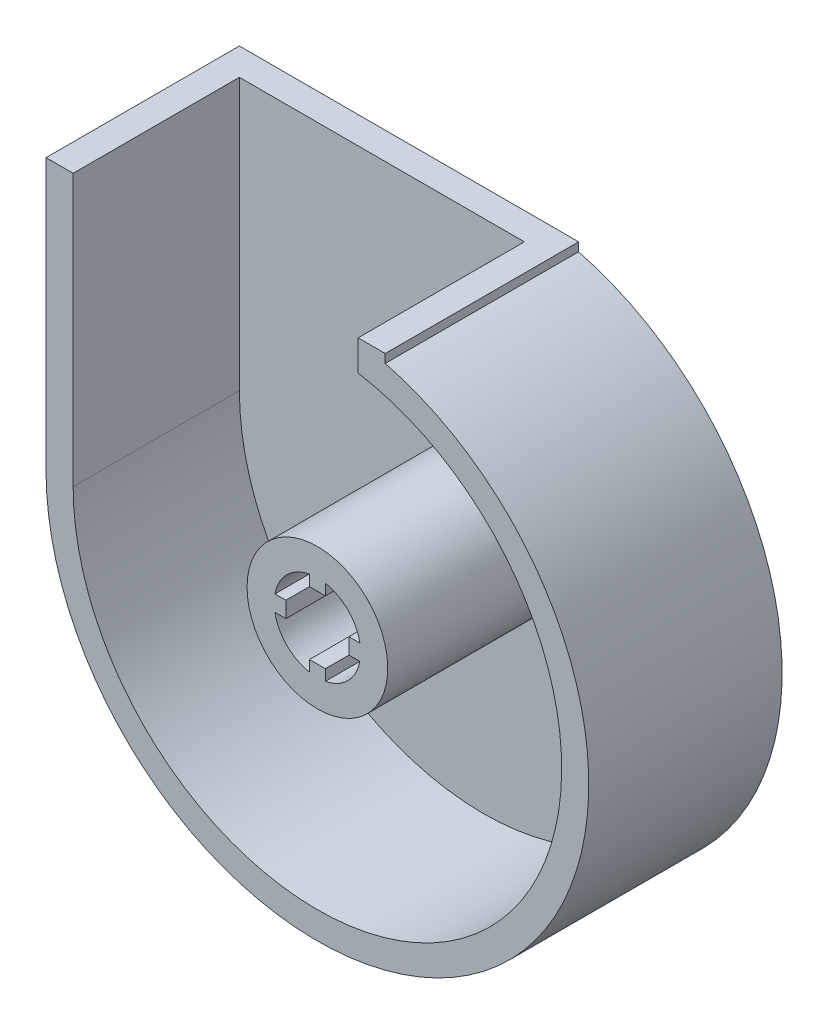
ISO-10303-21;
HEADER;
FILE_DESCRIPTION(('STEP AP214'),'2;1');
FILE_NAME('part.step','',(''),(''),'','','');
FILE_SCHEMA(('AUTOMOTIVE_DESIGN { 1 0 10303 214 1 1 1 1 }'));
ENDSEC;
DATA;
#1=APPLICATION_CONTEXT('core data for automotive mechanical design processes');
#2=APPLICATION_PROTOCOL_DEFINITION('international standard','automotive_design',2000,#1);
#3=PRODUCT_CONTEXT('',#1,'mechanical');
#4=PRODUCT('Part','Part','',(#3));
#5=PRODUCT_RELATED_PRODUCT_CATEGORY('part','',(#4));
#6=PRODUCT_DEFINITION_FORMATION('','',#4);
#7=PRODUCT_DEFINITION_CONTEXT('part definition',#1,'design');
#8=PRODUCT_DEFINITION('design','',#6,#7);
#9=PRODUCT_DEFINITION_SHAPE('','',#8);
#10=(LENGTH_UNIT() NAMED_UNIT(*) SI_UNIT(.MILLI.,.METRE.));
#11=(NAMED_UNIT(*) PLANE_ANGLE_UNIT() SI_UNIT($,.RADIAN.));
#12=(NAMED_UNIT(*) SI_UNIT($,.STERADIAN.) SOLID_ANGLE_UNIT());
#13=UNCERTAINTY_MEASURE_WITH_UNIT(LENGTH_MEASURE(1.E-05),#10,'distance_accuracy_value','');
#14=(GEOMETRIC_REPRESENTATION_CONTEXT(3) GLOBAL_UNCERTAINTY_ASSIGNED_CONTEXT((#13)) GLOBAL_UNIT_ASSIGNED_CONTEXT((#10,
#11,#12)) REPRESENTATION_CONTEXT('',''));
#15=CARTESIAN_POINT('',(0.,0.,0.));
#16=DIRECTION('',(0.,0.,1.));
#17=DIRECTION('',(1.,0.,0.));
#18=AXIS2_PLACEMENT_3D('',#15,#16,#17);
#19=CARTESIAN_POINT('',(0.,0.,0.));
#20=DIRECTION('',(0.,0.,-1.));
#21=DIRECTION('',(-1.,0.,0.));
#22=AXIS2_PLACEMENT_3D('',#19,#20,#21);
#23=PLANE('',#22);
#24=CARTESIAN_POINT('',(0.,0.,0.));
#25=DIRECTION('',(0.,0.,-1.));
#26=DIRECTION('',(-1.,0.,0.));
#27=AXIS2_PLACEMENT_3D('',#24,#25,#26);
#28=CIRCLE('',#27,72.01);
#29=CARTESIAN_POINT('',(12.01,71.0014084367346,0.));
#30=VERTEX_POINT('',#29);
#31=CARTESIAN_POINT('',(-72.01,0.,0.));
#32=VERTEX_POINT('',#31);
#33=EDGE_CURVE('E284',#30,#32,#28,.T.);
#34=ORIENTED_EDGE('',*,*,#33,.T.);
#35=DIRECTION('',(0.,-1.,0.));
#36=VECTOR('',#35,1.);
#37=CARTESIAN_POINT('',(-72.01,0.,0.));
#38=LINE('',#37,#36);
#39=CARTESIAN_POINT('',(-72.01,80.,0.));
#40=VERTEX_POINT('',#39);
#41=EDGE_CURVE('E280',#40,#32,#38,.T.);
#42=ORIENTED_EDGE('',*,*,#41,.F.);
#43=DIRECTION('',(-1.,0.,0.));
#44=VECTOR('',#43,1.);
#45=CARTESIAN_POINT('',(0.,80.,0.));
#46=LINE('',#45,#44);
#47=CARTESIAN_POINT('',(-80.,80.,0.));
#48=VERTEX_POINT('',#47);
#49=EDGE_CURVE('E282',#40,#48,#46,.T.);
#50=ORIENTED_EDGE('',*,*,#49,.T.);
#51=DIRECTION('',(0.,-1.,0.));
#52=VECTOR('',#51,1.);
#53=CARTESIAN_POINT('',(-80.,0.,0.));
#54=LINE('',#53,#52);
#55=CARTESIAN_POINT('',(-80.,0.,0.));
#56=VERTEX_POINT('',#55);
#57=EDGE_CURVE('E11',#48,#56,#54,.T.);
#58=ORIENTED_EDGE('',*,*,#57,.T.);
#59=CARTESIAN_POINT('',(0.,0.,0.));
#60=DIRECTION('',(0.,0.,-1.));
#61=DIRECTION('',(-1.,0.,0.));
#62=AXIS2_PLACEMENT_3D('',#59,#60,#61);
#63=CIRCLE('',#62,80.);
#64=CARTESIAN_POINT('',(20.,77.4596669241483,0.));
#65=VERTEX_POINT('',#64);
#66=EDGE_CURVE('E277',#65,#56,#63,.T.);
#67=ORIENTED_EDGE('',*,*,#66,.F.);
#68=DIRECTION('',(0.,-1.,0.));
#69=VECTOR('',#68,1.);
#70=CARTESIAN_POINT('',(20.,0.,0.));
#71=LINE('',#70,#69);
#72=CARTESIAN_POINT('',(20.,80.,0.));
#73=VERTEX_POINT('',#72);
#74=EDGE_CURVE('E279',#73,#65,#71,.T.);
#75=ORIENTED_EDGE('',*,*,#74,.F.);
#76=CARTESIAN_POINT('',(12.01,80.,0.));
#77=VERTEX_POINT('',#76);
#78=EDGE_CURVE('E285',#73,#77,#46,.T.);
#79=ORIENTED_EDGE('',*,*,#78,.T.);
#80=DIRECTION('',(0.,-1.,0.));
#81=VECTOR('',#80,1.);
#82=CARTESIAN_POINT('',(12.01,0.,0.));
#83=LINE('',#82,#81);
#84=EDGE_CURVE('E65',#77,#30,#83,.T.);
#85=ORIENTED_EDGE('',*,*,#84,.T.);
#86=EDGE_LOOP('',(#34,#42,#50,#58,#67,#75,#79,#85));
#87=FACE_BOUND('',#86,.T.);
#88=ADVANCED_FACE('F43',(#87),#23,.F.);
#89=CARTESIAN_POINT('',(0.,0.,0.));
#90=DIRECTION('',(0.,0.,-1.));
#91=DIRECTION('',(-1.,0.,0.));
#92=AXIS2_PLACEMENT_3D('',#89,#90,#91);
#93=CIRCLE('',#92,20.74);
#94=CARTESIAN_POINT('',(-20.74,0.,0.));
#95=VERTEX_POINT('',#94);
#96=EDGE_CURVE('E47',#95,#95,#93,.F.);
#97=ORIENTED_EDGE('',*,*,#96,.T.);
#98=EDGE_LOOP('',(#97));
#99=FACE_BOUND('',#98,.T.);
#100=CARTESIAN_POINT('',(0.,0.,0.));
#101=DIRECTION('',(0.,0.,-1.));
#102=DIRECTION('',(-1.,0.,0.));
#103=AXIS2_PLACEMENT_3D('',#100,#101,#102);
#104=CIRCLE('',#103,12.75);
#105=CARTESIAN_POINT('',(12.5315601582564,2.35,0.));
#106=VERTEX_POINT('',#105);
#107=CARTESIAN_POINT('',(2.35,12.5315601582564,0.));
#108=VERTEX_POINT('',#107);
#109=EDGE_CURVE('E272',#106,#108,#104,.F.);
#110=ORIENTED_EDGE('',*,*,#109,.F.);
#111=DIRECTION('',(1.,0.,0.));
#112=VECTOR('',#111,1.);
#113=CARTESIAN_POINT('',(12.5315601582564,2.35,0.));
#114=LINE('',#113,#112);
#115=CARTESIAN_POINT('',(9.3,2.35,0.));
#116=VERTEX_POINT('',#115);
#117=EDGE_CURVE('E270',#116,#106,#114,.T.);
#118=ORIENTED_EDGE('',*,*,#117,.F.);
#119=DIRECTION('',(0.,1.,0.));
#120=VECTOR('',#119,1.);
#121=CARTESIAN_POINT('',(9.3,2.35,0.));
#122=LINE('',#121,#120);
#123=CARTESIAN_POINT('',(9.3,-2.35,0.));
#124=VERTEX_POINT('',#123);
#125=EDGE_CURVE('E268',#124,#116,#122,.T.);
#126=ORIENTED_EDGE('',*,*,#125,.F.);
#127=DIRECTION('',(-1.,0.,0.));
#128=VECTOR('',#127,1.);
#129=CARTESIAN_POINT('',(9.3,-2.35,0.));
#130=LINE('',#129,#128);
#131=CARTESIAN_POINT('',(12.5315601582564,-2.35,0.));
#132=VERTEX_POINT('',#131);
#133=EDGE_CURVE('E266',#132,#124,#130,.T.);
#134=ORIENTED_EDGE('',*,*,#133,.F.);
#135=CARTESIAN_POINT('',(0.,0.,0.));
#136=DIRECTION('',(0.,0.,-1.));
#137=DIRECTION('',(-1.,0.,0.));
#138=AXIS2_PLACEMENT_3D('',#135,#136,#137);
#139=CIRCLE('',#138,12.75);
#140=CARTESIAN_POINT('',(2.35,-12.5315601582564,0.));
#141=VERTEX_POINT('',#140);
#142=EDGE_CURVE('E264',#141,#132,#139,.F.);
#143=ORIENTED_EDGE('',*,*,#142,.F.);
#144=DIRECTION('',(0.,-1.,0.));
#145=VECTOR('',#144,1.);
#146=CARTESIAN_POINT('',(2.35,-12.5315601582564,0.));
#147=LINE('',#146,#145);
#148=CARTESIAN_POINT('',(2.35,-9.3,0.));
#149=VERTEX_POINT('',#148);
#150=EDGE_CURVE('E262',#149,#141,#147,.T.);
#151=ORIENTED_EDGE('',*,*,#150,.F.);
#152=DIRECTION('',(1.,0.,0.));
#153=VECTOR('',#152,1.);
#154=CARTESIAN_POINT('',(2.35,-9.3,0.));
#155=LINE('',#154,#153);
#156=CARTESIAN_POINT('',(-2.35,-9.3,0.));
#157=VERTEX_POINT('',#156);
#158=EDGE_CURVE('E260',#157,#149,#155,.T.);
#159=ORIENTED_EDGE('',*,*,#158,.F.);
#160=DIRECTION('',(0.,1.,0.));
#161=VECTOR('',#160,1.);
#162=CARTESIAN_POINT('',(-2.35,-9.3,0.));
#163=LINE('',#162,#161);
#164=CARTESIAN_POINT('',(-2.35,-12.5315601582564,0.));
#165=VERTEX_POINT('',#164);
#166=EDGE_CURVE('E258',#165,#157,#163,.T.);
#167=ORIENTED_EDGE('',*,*,#166,.F.);
#168=CARTESIAN_POINT('',(0.,0.,0.));
#169=DIRECTION('',(0.,0.,-1.));
#170=DIRECTION('',(-1.,0.,0.));
#171=AXIS2_PLACEMENT_3D('',#168,#169,#170);
#172=CIRCLE('',#171,12.75);
#173=CARTESIAN_POINT('',(-12.5315601582564,-2.35,0.));
#174=VERTEX_POINT('',#173);
#175=EDGE_CURVE('E256',#174,#165,#172,.F.);
#176=ORIENTED_EDGE('',*,*,#175,.F.);
#177=DIRECTION('',(-1.,0.,0.));
#178=VECTOR('',#177,1.);
#179=CARTESIAN_POINT('',(-12.5315601582564,-2.35,0.));
#180=LINE('',#179,#178);
#181=CARTESIAN_POINT('',(-9.3,-2.35,0.));
#182=VERTEX_POINT('',#181);
#183=EDGE_CURVE('E254',#182,#174,#180,.T.);
#184=ORIENTED_EDGE('',*,*,#183,.F.);
#185=DIRECTION('',(0.,-1.,0.));
#186=VECTOR('',#185,1.);
#187=CARTESIAN_POINT('',(-9.3,-2.35,0.));
#188=LINE('',#187,#186);
#189=CARTESIAN_POINT('',(-9.3,2.35,0.));
#190=VERTEX_POINT('',#189);
#191=EDGE_CURVE('E252',#190,#182,#188,.T.);
#192=ORIENTED_EDGE('',*,*,#191,.F.);
#193=DIRECTION('',(1.,0.,0.));
#194=VECTOR('',#193,1.);
#195=CARTESIAN_POINT('',(-9.3,2.35,0.));
#196=LINE('',#195,#194);
#197=CARTESIAN_POINT('',(-12.5315601582564,2.35,0.));
#198=VERTEX_POINT('',#197);
#199=EDGE_CURVE('E250',#198,#190,#196,.T.);
#200=ORIENTED_EDGE('',*,*,#199,.F.);
#201=CARTESIAN_POINT('',(0.,0.,0.));
#202=DIRECTION('',(0.,0.,-1.));
#203=DIRECTION('',(-1.,0.,0.));
#204=AXIS2_PLACEMENT_3D('',#201,#202,#203);
#205=CIRCLE('',#204,12.75);
#206=CARTESIAN_POINT('',(-2.35,12.5315601582564,0.));
#207=VERTEX_POINT('',#206);
#208=EDGE_CURVE('E248',#207,#198,#205,.F.);
#209=ORIENTED_EDGE('',*,*,#208,.F.);
#210=DIRECTION('',(0.,1.,0.));
#211=VECTOR('',#210,1.);
#212=CARTESIAN_POINT('',(-2.35,12.5315601582564,0.));
#213=LINE('',#212,#211);
#214=CARTESIAN_POINT('',(-2.35,9.3,0.));
#215=VERTEX_POINT('',#214);
#216=EDGE_CURVE('E245',#215,#207,#213,.T.);
#217=ORIENTED_EDGE('',*,*,#216,.F.);
#218=DIRECTION('',(-1.,0.,0.));
#219=VECTOR('',#218,1.);
#220=CARTESIAN_POINT('',(-2.35,9.3,0.));
#221=LINE('',#220,#219);
#222=CARTESIAN_POINT('',(2.35,9.3,0.));
#223=VERTEX_POINT('',#222);
#224=EDGE_CURVE('E243',#223,#215,#221,.T.);
#225=ORIENTED_EDGE('',*,*,#224,.F.);
#226=DIRECTION('',(0.,-1.,0.));
#227=VECTOR('',#226,1.);
#228=CARTESIAN_POINT('',(2.35,9.3,0.));
#229=LINE('',#228,#227);
#230=EDGE_CURVE('E275',#108,#223,#229,.T.);
#231=ORIENTED_EDGE('',*,*,#230,.F.);
#232=EDGE_LOOP('',(#110,#118,#126,#134,#143,#151,#159,#167,#176,#184,#192,#200,#209,#217,#225,#231));
#233=FACE_BOUND('',#232,.T.);
#234=ADVANCED_FACE('F45',(#99,#233),#23,.F.);
#235=CARTESIAN_POINT('',(-105.,207.,-49.01));
#236=DIRECTION('',(0.,0.,1.));
#237=DIRECTION('',(0.,-1.,0.));
#238=AXIS2_PLACEMENT_3D('',#235,#236,#237);
#239=PLANE('',#238);
#240=CARTESIAN_POINT('',(0.,0.,-49.01));
#241=DIRECTION('',(0.,0.,1.));
#242=DIRECTION('',(0.,-1.,0.));
#243=AXIS2_PLACEMENT_3D('',#240,#241,#242);
#244=CIRCLE('',#243,20.74);
#245=CARTESIAN_POINT('',(0.,-20.74,-49.01));
#246=VERTEX_POINT('',#245);
#247=EDGE_CURVE('E238',#246,#246,#244,.T.);
#248=ORIENTED_EDGE('',*,*,#247,.F.);
#249=EDGE_LOOP('',(#248));
#250=FACE_BOUND('',#249,.T.);
#251=DIRECTION('',(0.,1.,0.));
#252=VECTOR('',#251,1.);
#253=CARTESIAN_POINT('',(12.01,0.,-49.01));
#254=LINE('',#253,#252);
#255=CARTESIAN_POINT('',(12.01,71.0014084367346,-49.01));
#256=VERTEX_POINT('',#255);
#257=CARTESIAN_POINT('',(12.01,80.,-49.01));
#258=VERTEX_POINT('',#257);
#259=EDGE_CURVE('E234',#256,#258,#254,.T.);
#260=ORIENTED_EDGE('',*,*,#259,.T.);
#261=DIRECTION('',(-1.,0.,0.));
#262=VECTOR('',#261,1.);
#263=CARTESIAN_POINT('',(-105.,80.,-49.01));
#264=LINE('',#263,#262);
#265=CARTESIAN_POINT('',(-72.01,80.,-49.01));
#266=VERTEX_POINT('',#265);
#267=EDGE_CURVE('E242',#258,#266,#264,.T.);
#268=ORIENTED_EDGE('',*,*,#267,.T.);
#269=DIRECTION('',(0.,1.,0.));
#270=VECTOR('',#269,1.);
#271=CARTESIAN_POINT('',(-72.01,0.,-49.01));
#272=LINE('',#271,#270);
#273=CARTESIAN_POINT('',(-72.01,0.,-49.01));
#274=VERTEX_POINT('',#273);
#275=EDGE_CURVE('E239',#274,#266,#272,.T.);
#276=ORIENTED_EDGE('',*,*,#275,.F.);
#277=CARTESIAN_POINT('',(0.,0.,-49.01));
#278=DIRECTION('',(0.,0.,1.));
#279=DIRECTION('',(0.,-1.,0.));
#280=AXIS2_PLACEMENT_3D('',#277,#278,#279);
#281=CIRCLE('',#280,72.01);
#282=EDGE_CURVE('E297',#274,#256,#281,.T.);
#283=ORIENTED_EDGE('',*,*,#282,.T.);
#284=EDGE_LOOP('',(#260,#268,#276,#283));
#285=FACE_BOUND('',#284,.T.);
#286=ADVANCED_FACE('F411',(#250,#285),#239,.T.);
#287=CARTESIAN_POINT('',(0.,0.,-105.));
#288=DIRECTION('',(0.,0.,1.));
#289=DIRECTION('',(1.,0.,0.));
#290=AXIS2_PLACEMENT_3D('',#287,#288,#289);
#291=CYLINDRICAL_SURFACE('',#290,20.74);
#292=ORIENTED_EDGE('',*,*,#96,.F.);
#293=EDGE_LOOP('',(#292));
#294=FACE_BOUND('',#293,.T.);
#295=ORIENTED_EDGE('',*,*,#247,.T.);
#296=EDGE_LOOP('',(#295));
#297=FACE_BOUND('',#296,.T.);
#298=ADVANCED_FACE('F433',(#294,#297),#291,.T.);
#299=CARTESIAN_POINT('',(0.,0.,105.));
#300=DIRECTION('',(0.,0.,-1.));
#301=DIRECTION('',(-1.,0.,0.));
#302=AXIS2_PLACEMENT_3D('',#299,#300,#301);
#303=CYLINDRICAL_SURFACE('',#302,72.01);
#304=ORIENTED_EDGE('',*,*,#33,.F.);
#305=DIRECTION('',(0.,0.,-1.));
#306=VECTOR('',#305,1.);
#307=CARTESIAN_POINT('',(12.01,71.0014084367346,49.01));
#308=LINE('',#307,#306);
#309=EDGE_CURVE('E237',#30,#256,#308,.T.);
#310=ORIENTED_EDGE('',*,*,#309,.T.);
#311=ORIENTED_EDGE('',*,*,#282,.F.);
#312=DIRECTION('',(0.,0.,-1.));
#313=VECTOR('',#312,1.);
#314=CARTESIAN_POINT('',(-72.01,0.,105.));
#315=LINE('',#314,#313);
#316=EDGE_CURVE('E233',#32,#274,#315,.T.);
#317=ORIENTED_EDGE('',*,*,#316,.F.);
#318=EDGE_LOOP('',(#304,#310,#311,#317));
#319=FACE_BOUND('',#318,.T.);
#320=ADVANCED_FACE('F295',(#319),#303,.F.);
#321=CARTESIAN_POINT('',(0.,80.,0.));
#322=DIRECTION('',(0.,1.,0.));
#323=DIRECTION('',(0.,0.,1.));
#324=AXIS2_PLACEMENT_3D('',#321,#322,#323);
#325=PLANE('',#324);
#326=ORIENTED_EDGE('',*,*,#78,.F.);
#327=DIRECTION('',(0.,0.,-1.));
#328=VECTOR('',#327,1.);
#329=CARTESIAN_POINT('',(20.,80.,105.));
#330=LINE('',#329,#328);
#331=CARTESIAN_POINT('',(20.,80.,-57.));
#332=VERTEX_POINT('',#331);
#333=EDGE_CURVE('E210',#73,#332,#330,.T.);
#334=ORIENTED_EDGE('',*,*,#333,.T.);
#335=DIRECTION('',(-1.,0.,0.));
#336=VECTOR('',#335,1.);
#337=CARTESIAN_POINT('',(-105.,80.,-57.));
#338=LINE('',#337,#336);
#339=CARTESIAN_POINT('',(-80.,80.,-57.));
#340=VERTEX_POINT('',#339);
#341=EDGE_CURVE('E217',#332,#340,#338,.T.);
#342=ORIENTED_EDGE('',*,*,#341,.T.);
#343=DIRECTION('',(0.,0.,-1.));
#344=VECTOR('',#343,1.);
#345=CARTESIAN_POINT('',(-80.,80.,105.));
#346=LINE('',#345,#344);
#347=EDGE_CURVE('E203',#48,#340,#346,.T.);
#348=ORIENTED_EDGE('',*,*,#347,.F.);
#349=ORIENTED_EDGE('',*,*,#49,.F.);
#350=DIRECTION('',(0.,0.,-1.));
#351=VECTOR('',#350,1.);
#352=CARTESIAN_POINT('',(-72.01,80.,105.));
#353=LINE('',#352,#351);
#354=EDGE_CURVE('E225',#40,#266,#353,.T.);
#355=ORIENTED_EDGE('',*,*,#354,.T.);
#356=ORIENTED_EDGE('',*,*,#267,.F.);
#357=DIRECTION('',(0.,0.,-1.));
#358=VECTOR('',#357,1.);
#359=CARTESIAN_POINT('',(12.01,80.,105.));
#360=LINE('',#359,#358);
#361=EDGE_CURVE('E209',#77,#258,#360,.T.);
#362=ORIENTED_EDGE('',*,*,#361,.F.);
#363=EDGE_LOOP('',(#326,#334,#342,#348,#349,#355,#356,#362));
#364=FACE_BOUND('',#363,.T.);
#365=ADVANCED_FACE('F222',(#364),#325,.T.);
#366=CARTESIAN_POINT('',(0.,0.,-105.));
#367=DIRECTION('',(0.,0.,1.));
#368=DIRECTION('',(1.,0.,0.));
#369=AXIS2_PLACEMENT_3D('',#366,#367,#368);
#370=CYLINDRICAL_SURFACE('',#369,12.75);
#371=DIRECTION('',(0.,0.,1.));
#372=VECTOR('',#371,1.);
#373=CARTESIAN_POINT('',(12.5315601582564,2.35,-105.));
#374=LINE('',#373,#372);
#375=CARTESIAN_POINT('',(12.5315601582564,2.35,-57.));
#376=VERTEX_POINT('',#375);
#377=EDGE_CURVE('E399',#376,#106,#374,.T.);
#378=ORIENTED_EDGE('',*,*,#377,.T.);
#379=ORIENTED_EDGE('',*,*,#109,.T.);
#380=DIRECTION('',(0.,0.,1.));
#381=VECTOR('',#380,1.);
#382=CARTESIAN_POINT('',(2.35,12.5315601582564,-105.));
#383=LINE('',#382,#381);
#384=CARTESIAN_POINT('',(2.35,12.5315601582564,-57.));
#385=VERTEX_POINT('',#384);
#386=EDGE_CURVE('E357',#385,#108,#383,.T.);
#387=ORIENTED_EDGE('',*,*,#386,.F.);
#388=CARTESIAN_POINT('',(0.,0.,-57.));
#389=DIRECTION('',(0.,0.,1.));
#390=DIRECTION('',(0.,-1.,0.));
#391=AXIS2_PLACEMENT_3D('',#388,#389,#390);
#392=CIRCLE('',#391,12.75);
#393=EDGE_CURVE('E312',#376,#385,#392,.T.);
#394=ORIENTED_EDGE('',*,*,#393,.F.);
#395=EDGE_LOOP('',(#378,#379,#387,#394));
#396=FACE_BOUND('',#395,.T.);
#397=ADVANCED_FACE('F446',(#396),#370,.F.);
#398=CARTESIAN_POINT('',(12.5315601582564,2.35,-105.));
#399=DIRECTION('',(0.,-1.,0.));
#400=DIRECTION('',(1.,0.,0.));
#401=AXIS2_PLACEMENT_3D('',#398,#399,#400);
#402=PLANE('',#401);
#403=DIRECTION('',(0.,0.,1.));
#404=VECTOR('',#403,1.);
#405=CARTESIAN_POINT('',(9.3,2.35,-105.));
#406=LINE('',#405,#404);
#407=CARTESIAN_POINT('',(9.3,2.35,-57.));
#408=VERTEX_POINT('',#407);
#409=EDGE_CURVE('E396',#408,#116,#406,.T.);
#410=ORIENTED_EDGE('',*,*,#409,.T.);
#411=ORIENTED_EDGE('',*,*,#117,.T.);
#412=ORIENTED_EDGE('',*,*,#377,.F.);
#413=DIRECTION('',(1.,0.,0.));
#414=VECTOR('',#413,1.);
#415=CARTESIAN_POINT('',(-105.,2.34999999999991,-57.));
#416=LINE('',#415,#414);
#417=EDGE_CURVE('E315',#408,#376,#416,.T.);
#418=ORIENTED_EDGE('',*,*,#417,.F.);
#419=EDGE_LOOP('',(#410,#411,#412,#418));
#420=FACE_BOUND('',#419,.T.);
#421=ADVANCED_FACE('F448',(#420),#402,.F.);
#422=CARTESIAN_POINT('',(9.3,2.35,-105.));
#423=DIRECTION('',(1.,0.,0.));
#424=DIRECTION('',(0.,0.,-1.));
#425=AXIS2_PLACEMENT_3D('',#422,#423,#424);
#426=PLANE('',#425);
#427=DIRECTION('',(0.,0.,1.));
#428=VECTOR('',#427,1.);
#429=CARTESIAN_POINT('',(9.3,-2.35,-105.));
#430=LINE('',#429,#428);
#431=CARTESIAN_POINT('',(9.3,-2.35,-57.));
#432=VERTEX_POINT('',#431);
#433=EDGE_CURVE('E393',#432,#124,#430,.T.);
#434=ORIENTED_EDGE('',*,*,#433,.T.);
#435=ORIENTED_EDGE('',*,*,#125,.T.);
#436=ORIENTED_EDGE('',*,*,#409,.F.);
#437=DIRECTION('',(0.,1.,0.));
#438=VECTOR('',#437,1.);
#439=CARTESIAN_POINT('',(9.3,207.,-57.));
#440=LINE('',#439,#438);
#441=EDGE_CURVE('E318',#432,#408,#440,.T.);
#442=ORIENTED_EDGE('',*,*,#441,.F.);
#443=EDGE_LOOP('',(#434,#435,#436,#442));
#444=FACE_BOUND('',#443,.T.);
#445=ADVANCED_FACE('F453',(#444),#426,.F.);
#446=CARTESIAN_POINT('',(9.3,-2.35,-105.));
#447=DIRECTION('',(0.,1.,0.));
#448=DIRECTION('',(-1.,0.,0.));
#449=AXIS2_PLACEMENT_3D('',#446,#447,#448);
#450=PLANE('',#449);
#451=DIRECTION('',(0.,0.,1.));
#452=VECTOR('',#451,1.);
#453=CARTESIAN_POINT('',(12.5315601582564,-2.35,-105.));
#454=LINE('',#453,#452);
#455=CARTESIAN_POINT('',(12.5315601582564,-2.35,-57.));
#456=VERTEX_POINT('',#455);
#457=EDGE_CURVE('E390',#456,#132,#454,.T.);
#458=ORIENTED_EDGE('',*,*,#457,.T.);
#459=ORIENTED_EDGE('',*,*,#133,.T.);
#460=ORIENTED_EDGE('',*,*,#433,.F.);
#461=DIRECTION('',(-1.,0.,0.));
#462=VECTOR('',#461,1.);
#463=CARTESIAN_POINT('',(-105.,-2.34999999999994,-57.));
#464=LINE('',#463,#462);
#465=EDGE_CURVE('E321',#456,#432,#464,.T.);
#466=ORIENTED_EDGE('',*,*,#465,.F.);
#467=EDGE_LOOP('',(#458,#459,#460,#466));
#468=FACE_BOUND('',#467,.T.);
#469=ADVANCED_FACE('F455',(#468),#450,.F.);
#470=CARTESIAN_POINT('',(0.,0.,-105.));
#471=DIRECTION('',(0.,0.,1.));
#472=DIRECTION('',(1.,0.,0.));
#473=AXIS2_PLACEMENT_3D('',#470,#471,#472);
#474=CYLINDRICAL_SURFACE('',#473,12.75);
#475=DIRECTION('',(0.,0.,1.));
#476=VECTOR('',#475,1.);
#477=CARTESIAN_POINT('',(2.35,-12.5315601582564,-105.));
#478=LINE('',#477,#476);
#479=CARTESIAN_POINT('',(2.35,-12.5315601582564,-57.));
#480=VERTEX_POINT('',#479);
#481=EDGE_CURVE('E387',#480,#141,#478,.T.);
#482=ORIENTED_EDGE('',*,*,#481,.T.);
#483=ORIENTED_EDGE('',*,*,#142,.T.);
#484=ORIENTED_EDGE('',*,*,#457,.F.);
#485=CARTESIAN_POINT('',(0.,0.,-57.));
#486=DIRECTION('',(0.,0.,1.));
#487=DIRECTION('',(0.,-1.,0.));
#488=AXIS2_PLACEMENT_3D('',#485,#486,#487);
#489=CIRCLE('',#488,12.75);
#490=EDGE_CURVE('E324',#480,#456,#489,.T.);
#491=ORIENTED_EDGE('',*,*,#490,.F.);
#492=EDGE_LOOP('',(#482,#483,#484,#491));
#493=FACE_BOUND('',#492,.T.);
#494=ADVANCED_FACE('F463',(#493),#474,.F.);
#495=CARTESIAN_POINT('',(2.35,-12.5315601582564,-105.));
#496=DIRECTION('',(-1.,0.,0.));
#497=DIRECTION('',(0.,-1.,0.));
#498=AXIS2_PLACEMENT_3D('',#495,#496,#497);
#499=PLANE('',#498);
#500=DIRECTION('',(0.,0.,1.));
#501=VECTOR('',#500,1.);
#502=CARTESIAN_POINT('',(2.35,-9.3,-105.));
#503=LINE('',#502,#501);
#504=CARTESIAN_POINT('',(2.35,-9.3,-57.));
#505=VERTEX_POINT('',#504);
#506=EDGE_CURVE('E384',#505,#149,#503,.T.);
#507=ORIENTED_EDGE('',*,*,#506,.T.);
#508=ORIENTED_EDGE('',*,*,#150,.T.);
#509=ORIENTED_EDGE('',*,*,#481,.F.);
#510=DIRECTION('',(0.,-1.,0.));
#511=VECTOR('',#510,1.);
#512=CARTESIAN_POINT('',(2.34999999999989,207.,-57.));
#513=LINE('',#512,#511);
#514=EDGE_CURVE('E327',#505,#480,#513,.T.);
#515=ORIENTED_EDGE('',*,*,#514,.F.);
#516=EDGE_LOOP('',(#507,#508,#509,#515));
#517=FACE_BOUND('',#516,.T.);
#518=ADVANCED_FACE('F465',(#517),#499,.F.);
#519=CARTESIAN_POINT('',(2.35,-9.3,-105.));
#520=DIRECTION('',(0.,-1.,0.));
#521=DIRECTION('',(0.,0.,-1.));
#522=AXIS2_PLACEMENT_3D('',#519,#520,#521);
#523=PLANE('',#522);
#524=DIRECTION('',(0.,0.,1.));
#525=VECTOR('',#524,1.);
#526=CARTESIAN_POINT('',(-2.35,-9.3,-105.));
#527=LINE('',#526,#525);
#528=CARTESIAN_POINT('',(-2.35,-9.3,-57.));
#529=VERTEX_POINT('',#528);
#530=EDGE_CURVE('E381',#529,#157,#527,.T.);
#531=ORIENTED_EDGE('',*,*,#530,.T.);
#532=ORIENTED_EDGE('',*,*,#158,.T.);
#533=ORIENTED_EDGE('',*,*,#506,.F.);
#534=DIRECTION('',(1.,0.,0.));
#535=VECTOR('',#534,1.);
#536=CARTESIAN_POINT('',(-105.,-9.3,-57.));
#537=LINE('',#536,#535);
#538=EDGE_CURVE('E330',#529,#505,#537,.T.);
#539=ORIENTED_EDGE('',*,*,#538,.F.);
#540=EDGE_LOOP('',(#531,#532,#533,#539));
#541=FACE_BOUND('',#540,.T.);
#542=ADVANCED_FACE('F469',(#541),#523,.F.);
#543=CARTESIAN_POINT('',(-2.35,-9.3,-105.));
#544=DIRECTION('',(1.,0.,0.));
#545=DIRECTION('',(0.,1.,0.));
#546=AXIS2_PLACEMENT_3D('',#543,#544,#545);
#547=PLANE('',#546);
#548=DIRECTION('',(0.,0.,1.));
#549=VECTOR('',#548,1.);
#550=CARTESIAN_POINT('',(-2.35,-12.5315601582564,-105.));
#551=LINE('',#550,#549);
#552=CARTESIAN_POINT('',(-2.35,-12.5315601582564,-57.));
#553=VERTEX_POINT('',#552);
#554=EDGE_CURVE('E378',#553,#165,#551,.T.);
#555=ORIENTED_EDGE('',*,*,#554,.T.);
#556=ORIENTED_EDGE('',*,*,#166,.T.);
#557=ORIENTED_EDGE('',*,*,#530,.F.);
#558=DIRECTION('',(0.,1.,0.));
#559=VECTOR('',#558,1.);
#560=CARTESIAN_POINT('',(-2.34999999999989,207.,-57.));
#561=LINE('',#560,#559);
#562=EDGE_CURVE('E333',#553,#529,#561,.T.);
#563=ORIENTED_EDGE('',*,*,#562,.F.);
#564=EDGE_LOOP('',(#555,#556,#557,#563));
#565=FACE_BOUND('',#564,.T.);
#566=ADVANCED_FACE('F471',(#565),#547,.F.);
#567=CARTESIAN_POINT('',(0.,0.,-105.));
#568=DIRECTION('',(0.,0.,1.));
#569=DIRECTION('',(1.,0.,0.));
#570=AXIS2_PLACEMENT_3D('',#567,#568,#569);
#571=CYLINDRICAL_SURFACE('',#570,12.75);
#572=DIRECTION('',(0.,0.,1.));
#573=VECTOR('',#572,1.);
#574=CARTESIAN_POINT('',(-12.5315601582564,-2.35,-105.));
#575=LINE('',#574,#573);
#576=CARTESIAN_POINT('',(-12.5315601582564,-2.35,-57.));
#577=VERTEX_POINT('',#576);
#578=EDGE_CURVE('E375',#577,#174,#575,.T.);
#579=ORIENTED_EDGE('',*,*,#578,.T.);
#580=ORIENTED_EDGE('',*,*,#175,.T.);
#581=ORIENTED_EDGE('',*,*,#554,.F.);
#582=CARTESIAN_POINT('',(0.,0.,-57.));
#583=DIRECTION('',(0.,0.,1.));
#584=DIRECTION('',(0.,-1.,0.));
#585=AXIS2_PLACEMENT_3D('',#582,#583,#584);
#586=CIRCLE('',#585,12.75);
#587=EDGE_CURVE('E336',#577,#553,#586,.T.);
#588=ORIENTED_EDGE('',*,*,#587,.F.);
#589=EDGE_LOOP('',(#579,#580,#581,#588));
#590=FACE_BOUND('',#589,.T.);
#591=ADVANCED_FACE('F479',(#590),#571,.F.);
#592=CARTESIAN_POINT('',(-12.5315601582564,-2.35,-105.));
#593=DIRECTION('',(0.,1.,0.));
#594=DIRECTION('',(-1.,0.,0.));
#595=AXIS2_PLACEMENT_3D('',#592,#593,#594);
#596=PLANE('',#595);
#597=DIRECTION('',(0.,0.,1.));
#598=VECTOR('',#597,1.);
#599=CARTESIAN_POINT('',(-9.3,-2.35,-105.));
#600=LINE('',#599,#598);
#601=CARTESIAN_POINT('',(-9.3,-2.35,-57.));
#602=VERTEX_POINT('',#601);
#603=EDGE_CURVE('E372',#602,#182,#600,.T.);
#604=ORIENTED_EDGE('',*,*,#603,.T.);
#605=ORIENTED_EDGE('',*,*,#183,.T.);
#606=ORIENTED_EDGE('',*,*,#578,.F.);
#607=DIRECTION('',(-1.,0.,0.));
#608=VECTOR('',#607,1.);
#609=CARTESIAN_POINT('',(-105.,-2.35000000000005,-57.));
#610=LINE('',#609,#608);
#611=EDGE_CURVE('E339',#602,#577,#610,.T.);
#612=ORIENTED_EDGE('',*,*,#611,.F.);
#613=EDGE_LOOP('',(#604,#605,#606,#612));
#614=FACE_BOUND('',#613,.T.);
#615=ADVANCED_FACE('F481',(#614),#596,.F.);
#616=CARTESIAN_POINT('',(-9.3,-2.35,-105.));
#617=DIRECTION('',(-1.,0.,0.));
#618=DIRECTION('',(0.,0.,1.));
#619=AXIS2_PLACEMENT_3D('',#616,#617,#618);
#620=PLANE('',#619);
#621=DIRECTION('',(0.,0.,1.));
#622=VECTOR('',#621,1.);
#623=CARTESIAN_POINT('',(-9.3,2.35,-105.));
#624=LINE('',#623,#622);
#625=CARTESIAN_POINT('',(-9.3,2.35,-57.));
#626=VERTEX_POINT('',#625);
#627=EDGE_CURVE('E369',#626,#190,#624,.T.);
#628=ORIENTED_EDGE('',*,*,#627,.T.);
#629=ORIENTED_EDGE('',*,*,#191,.T.);
#630=ORIENTED_EDGE('',*,*,#603,.F.);
#631=DIRECTION('',(0.,-1.,0.));
#632=VECTOR('',#631,1.);
#633=CARTESIAN_POINT('',(-9.3,207.,-57.));
#634=LINE('',#633,#632);
#635=EDGE_CURVE('E342',#626,#602,#634,.T.);
#636=ORIENTED_EDGE('',*,*,#635,.F.);
#637=EDGE_LOOP('',(#628,#629,#630,#636));
#638=FACE_BOUND('',#637,.T.);
#639=ADVANCED_FACE('F485',(#638),#620,.F.);
#640=CARTESIAN_POINT('',(-9.3,2.35,-105.));
#641=DIRECTION('',(0.,-1.,0.));
#642=DIRECTION('',(1.,0.,0.));
#643=AXIS2_PLACEMENT_3D('',#640,#641,#642);
#644=PLANE('',#643);
#645=DIRECTION('',(0.,0.,1.));
#646=VECTOR('',#645,1.);
#647=CARTESIAN_POINT('',(-12.5315601582564,2.35,-105.));
#648=LINE('',#647,#646);
#649=CARTESIAN_POINT('',(-12.5315601582564,2.35,-57.));
#650=VERTEX_POINT('',#649);
#651=EDGE_CURVE('E366',#650,#198,#648,.T.);
#652=ORIENTED_EDGE('',*,*,#651,.T.);
#653=ORIENTED_EDGE('',*,*,#199,.T.);
#654=ORIENTED_EDGE('',*,*,#627,.F.);
#655=DIRECTION('',(1.,0.,0.));
#656=VECTOR('',#655,1.);
#657=CARTESIAN_POINT('',(-105.,2.35000000000002,-57.));
#658=LINE('',#657,#656);
#659=EDGE_CURVE('E345',#650,#626,#658,.T.);
#660=ORIENTED_EDGE('',*,*,#659,.F.);
#661=EDGE_LOOP('',(#652,#653,#654,#660));
#662=FACE_BOUND('',#661,.T.);
#663=ADVANCED_FACE('F487',(#662),#644,.F.);
#664=CARTESIAN_POINT('',(0.,0.,-105.));
#665=DIRECTION('',(0.,0.,1.));
#666=DIRECTION('',(1.,0.,0.));
#667=AXIS2_PLACEMENT_3D('',#664,#665,#666);
#668=CYLINDRICAL_SURFACE('',#667,12.75);
#669=DIRECTION('',(0.,0.,1.));
#670=VECTOR('',#669,1.);
#671=CARTESIAN_POINT('',(-2.35,12.5315601582564,-105.));
#672=LINE('',#671,#670);
#673=CARTESIAN_POINT('',(-2.35,12.5315601582564,-57.));
#674=VERTEX_POINT('',#673);
#675=EDGE_CURVE('E363',#674,#207,#672,.T.);
#676=ORIENTED_EDGE('',*,*,#675,.T.);
#677=ORIENTED_EDGE('',*,*,#208,.T.);
#678=ORIENTED_EDGE('',*,*,#651,.F.);
#679=CARTESIAN_POINT('',(0.,0.,-57.));
#680=DIRECTION('',(0.,0.,1.));
#681=DIRECTION('',(0.,-1.,0.));
#682=AXIS2_PLACEMENT_3D('',#679,#680,#681);
#683=CIRCLE('',#682,12.75);
#684=EDGE_CURVE('E348',#674,#650,#683,.T.);
#685=ORIENTED_EDGE('',*,*,#684,.F.);
#686=EDGE_LOOP('',(#676,#677,#678,#685));
#687=FACE_BOUND('',#686,.T.);
#688=ADVANCED_FACE('F494',(#687),#668,.F.);
#689=CARTESIAN_POINT('',(-105.,207.,-57.));
#690=DIRECTION('',(0.,0.,1.));
#691=DIRECTION('',(0.,-1.,0.));
#692=AXIS2_PLACEMENT_3D('',#689,#690,#691);
#693=PLANE('',#692);
#694=ORIENTED_EDGE('',*,*,#393,.T.);
#695=DIRECTION('',(0.,-1.,0.));
#696=VECTOR('',#695,1.);
#697=CARTESIAN_POINT('',(2.35000000000012,207.,-57.));
#698=LINE('',#697,#696);
#699=CARTESIAN_POINT('',(2.35,9.3,-57.));
#700=VERTEX_POINT('',#699);
#701=EDGE_CURVE('E309',#385,#700,#698,.T.);
#702=ORIENTED_EDGE('',*,*,#701,.T.);
#703=DIRECTION('',(-1.,0.,0.));
#704=VECTOR('',#703,1.);
#705=CARTESIAN_POINT('',(-105.,9.3,-57.));
#706=LINE('',#705,#704);
#707=CARTESIAN_POINT('',(-2.35,9.3,-57.));
#708=VERTEX_POINT('',#707);
#709=EDGE_CURVE('E354',#700,#708,#706,.T.);
#710=ORIENTED_EDGE('',*,*,#709,.T.);
#711=DIRECTION('',(0.,1.,0.));
#712=VECTOR('',#711,1.);
#713=CARTESIAN_POINT('',(-2.35000000000012,207.,-57.));
#714=LINE('',#713,#712);
#715=EDGE_CURVE('E351',#708,#674,#714,.T.);
#716=ORIENTED_EDGE('',*,*,#715,.T.);
#717=ORIENTED_EDGE('',*,*,#684,.T.);
#718=ORIENTED_EDGE('',*,*,#659,.T.);
#719=ORIENTED_EDGE('',*,*,#635,.T.);
#720=ORIENTED_EDGE('',*,*,#611,.T.);
#721=ORIENTED_EDGE('',*,*,#587,.T.);
#722=ORIENTED_EDGE('',*,*,#562,.T.);
#723=ORIENTED_EDGE('',*,*,#538,.T.);
#724=ORIENTED_EDGE('',*,*,#514,.T.);
#725=ORIENTED_EDGE('',*,*,#490,.T.);
#726=ORIENTED_EDGE('',*,*,#465,.T.);
#727=ORIENTED_EDGE('',*,*,#441,.T.);
#728=ORIENTED_EDGE('',*,*,#417,.T.);
#729=EDGE_LOOP('',(#694,#702,#710,#716,#717,#718,#719,#720,#721,#722,#723,#724,#725,#726,#727,#728));
#730=FACE_BOUND('',#729,.T.);
#731=ORIENTED_EDGE('',*,*,#341,.F.);
#732=DIRECTION('',(0.,1.,0.));
#733=VECTOR('',#732,1.);
#734=CARTESIAN_POINT('',(20.,0.,-57.));
#735=LINE('',#734,#733);
#736=CARTESIAN_POINT('',(20.,77.4596669241483,-57.));
#737=VERTEX_POINT('',#736);
#738=EDGE_CURVE('E230',#737,#332,#735,.T.);
#739=ORIENTED_EDGE('',*,*,#738,.F.);
#740=CARTESIAN_POINT('',(0.,0.,-57.));
#741=DIRECTION('',(0.,0.,1.));
#742=DIRECTION('',(0.,-1.,0.));
#743=AXIS2_PLACEMENT_3D('',#740,#741,#742);
#744=CIRCLE('',#743,80.);
#745=CARTESIAN_POINT('',(-80.,0.,-57.));
#746=VERTEX_POINT('',#745);
#747=EDGE_CURVE('E219',#746,#737,#744,.T.);
#748=ORIENTED_EDGE('',*,*,#747,.F.);
#749=DIRECTION('',(0.,1.,0.));
#750=VECTOR('',#749,1.);
#751=CARTESIAN_POINT('',(-80.,0.,-57.));
#752=LINE('',#751,#750);
#753=EDGE_CURVE('E206',#746,#340,#752,.T.);
#754=ORIENTED_EDGE('',*,*,#753,.T.);
#755=EDGE_LOOP('',(#731,#739,#748,#754));
#756=FACE_BOUND('',#755,.T.);
#757=ADVANCED_FACE('F215',(#730,#756),#693,.F.);
#758=CARTESIAN_POINT('',(-2.35,12.5315601582564,-105.));
#759=DIRECTION('',(1.,0.,0.));
#760=DIRECTION('',(0.,1.,0.));
#761=AXIS2_PLACEMENT_3D('',#758,#759,#760);
#762=PLANE('',#761);
#763=DIRECTION('',(0.,0.,1.));
#764=VECTOR('',#763,1.);
#765=CARTESIAN_POINT('',(-2.35,9.3,-105.));
#766=LINE('',#765,#764);
#767=EDGE_CURVE('E360',#708,#215,#766,.T.);
#768=ORIENTED_EDGE('',*,*,#767,.T.);
#769=ORIENTED_EDGE('',*,*,#216,.T.);
#770=ORIENTED_EDGE('',*,*,#675,.F.);
#771=ORIENTED_EDGE('',*,*,#715,.F.);
#772=EDGE_LOOP('',(#768,#769,#770,#771));
#773=FACE_BOUND('',#772,.T.);
#774=ADVANCED_FACE('F497',(#773),#762,.F.);
#775=CARTESIAN_POINT('',(2.35,9.3,-105.));
#776=DIRECTION('',(-1.,0.,0.));
#777=DIRECTION('',(0.,-1.,0.));
#778=AXIS2_PLACEMENT_3D('',#775,#776,#777);
#779=PLANE('',#778);
#780=ORIENTED_EDGE('',*,*,#386,.T.);
#781=ORIENTED_EDGE('',*,*,#230,.T.);
#782=DIRECTION('',(0.,0.,1.));
#783=VECTOR('',#782,1.);
#784=CARTESIAN_POINT('',(2.35,9.3,-105.));
#785=LINE('',#784,#783);
#786=EDGE_CURVE('E246',#700,#223,#785,.T.);
#787=ORIENTED_EDGE('',*,*,#786,.F.);
#788=ORIENTED_EDGE('',*,*,#701,.F.);
#789=EDGE_LOOP('',(#780,#781,#787,#788));
#790=FACE_BOUND('',#789,.T.);
#791=ADVANCED_FACE('F502',(#790),#779,.F.);
#792=CARTESIAN_POINT('',(-2.35,9.3,-105.));
#793=DIRECTION('',(0.,1.,0.));
#794=DIRECTION('',(0.,0.,1.));
#795=AXIS2_PLACEMENT_3D('',#792,#793,#794);
#796=PLANE('',#795);
#797=ORIENTED_EDGE('',*,*,#786,.T.);
#798=ORIENTED_EDGE('',*,*,#224,.T.);
#799=ORIENTED_EDGE('',*,*,#767,.F.);
#800=ORIENTED_EDGE('',*,*,#709,.F.);
#801=EDGE_LOOP('',(#797,#798,#799,#800));
#802=FACE_BOUND('',#801,.T.);
#803=ADVANCED_FACE('F500',(#802),#796,.F.);
#804=CARTESIAN_POINT('',(-80.,0.,105.));
#805=DIRECTION('',(-1.,0.,0.));
#806=DIRECTION('',(0.,0.,1.));
#807=AXIS2_PLACEMENT_3D('',#804,#805,#806);
#808=PLANE('',#807);
#809=ORIENTED_EDGE('',*,*,#57,.F.);
#810=ORIENTED_EDGE('',*,*,#347,.T.);
#811=ORIENTED_EDGE('',*,*,#753,.F.);
#812=DIRECTION('',(0.,0.,-1.));
#813=VECTOR('',#812,1.);
#814=CARTESIAN_POINT('',(-80.,0.,105.));
#815=LINE('',#814,#813);
#816=EDGE_CURVE('E232',#56,#746,#815,.T.);
#817=ORIENTED_EDGE('',*,*,#816,.F.);
#818=EDGE_LOOP('',(#809,#810,#811,#817));
#819=FACE_BOUND('',#818,.T.);
#820=ADVANCED_FACE('F205',(#819),#808,.T.);
#821=CARTESIAN_POINT('',(20.,0.,105.));
#822=DIRECTION('',(-1.,0.,0.));
#823=DIRECTION('',(0.,0.,1.));
#824=AXIS2_PLACEMENT_3D('',#821,#822,#823);
#825=PLANE('',#824);
#826=ORIENTED_EDGE('',*,*,#333,.F.);
#827=ORIENTED_EDGE('',*,*,#74,.T.);
#828=DIRECTION('',(0.,0.,-1.));
#829=VECTOR('',#828,1.);
#830=CARTESIAN_POINT('',(20.,77.4596669241483,105.));
#831=LINE('',#830,#829);
#832=EDGE_CURVE('E220',#65,#737,#831,.T.);
#833=ORIENTED_EDGE('',*,*,#832,.T.);
#834=ORIENTED_EDGE('',*,*,#738,.T.);
#835=EDGE_LOOP('',(#826,#827,#833,#834));
#836=FACE_BOUND('',#835,.T.);
#837=ADVANCED_FACE('F421',(#836),#825,.F.);
#838=CARTESIAN_POINT('',(0.,0.,105.));
#839=DIRECTION('',(0.,0.,-1.));
#840=DIRECTION('',(-1.,0.,0.));
#841=AXIS2_PLACEMENT_3D('',#838,#839,#840);
#842=CYLINDRICAL_SURFACE('',#841,80.);
#843=ORIENTED_EDGE('',*,*,#832,.F.);
#844=ORIENTED_EDGE('',*,*,#66,.T.);
#845=ORIENTED_EDGE('',*,*,#816,.T.);
#846=ORIENTED_EDGE('',*,*,#747,.T.);
#847=EDGE_LOOP('',(#843,#844,#845,#846));
#848=FACE_BOUND('',#847,.T.);
#849=ADVANCED_FACE('F414',(#848),#842,.T.);
#850=CARTESIAN_POINT('',(-72.01,0.,105.));
#851=DIRECTION('',(-1.,0.,0.));
#852=DIRECTION('',(0.,0.,1.));
#853=AXIS2_PLACEMENT_3D('',#850,#851,#852);
#854=PLANE('',#853);
#855=ORIENTED_EDGE('',*,*,#354,.F.);
#856=ORIENTED_EDGE('',*,*,#41,.T.);
#857=ORIENTED_EDGE('',*,*,#316,.T.);
#858=ORIENTED_EDGE('',*,*,#275,.T.);
#859=EDGE_LOOP('',(#855,#856,#857,#858));
#860=FACE_BOUND('',#859,.T.);
#861=ADVANCED_FACE('F412',(#860),#854,.F.);
#862=CARTESIAN_POINT('',(12.01,0.,105.));
#863=DIRECTION('',(-1.,0.,0.));
#864=DIRECTION('',(0.,0.,1.));
#865=AXIS2_PLACEMENT_3D('',#862,#863,#864);
#866=PLANE('',#865);
#867=ORIENTED_EDGE('',*,*,#84,.F.);
#868=ORIENTED_EDGE('',*,*,#361,.T.);
#869=ORIENTED_EDGE('',*,*,#259,.F.);
#870=ORIENTED_EDGE('',*,*,#309,.F.);
#871=EDGE_LOOP('',(#867,#868,#869,#870));
#872=FACE_BOUND('',#871,.T.);
#873=ADVANCED_FACE('F409',(#872),#866,.T.);
#874=CLOSED_SHELL('',(#88,#234,#286,#298,#320,#365,#397,#421,#445,#469,#494,#518,#542,#566,#591,
#615,#639,#663,#688,#757,#774,#791,#803,#820,#837,#849,#861,#873));
#875=MANIFOLD_SOLID_BREP('B2',#874);
#876=ADVANCED_BREP_SHAPE_REPRESENTATION('',(#18,#875),#14);
#877=SHAPE_DEFINITION_REPRESENTATION(#9,#876);
ENDSEC;
END-ISO-10303-21;
